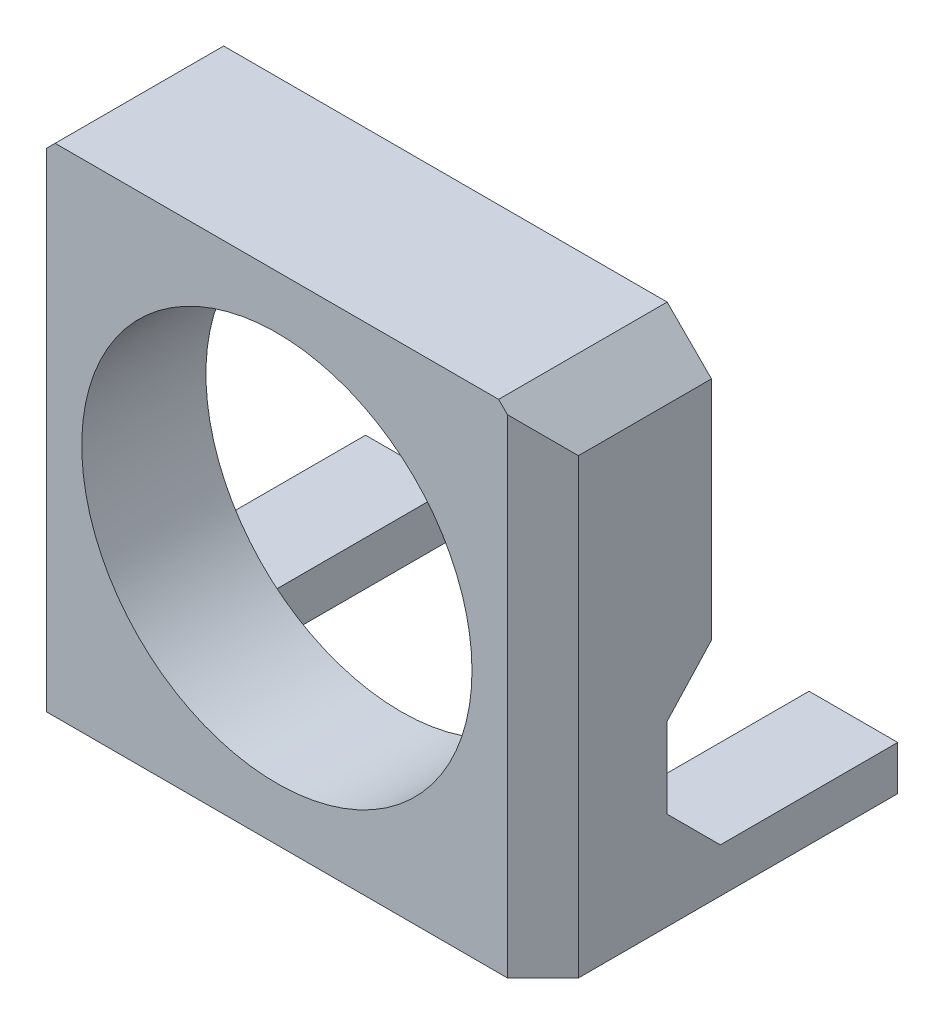
ISO-10303-21;
HEADER;
FILE_DESCRIPTION(('STEP AP214'),'2;1');
FILE_NAME('part.step','',(''),(''),'','','');
FILE_SCHEMA(('AUTOMOTIVE_DESIGN { 1 0 10303 214 1 1 1 1 }'));
ENDSEC;
DATA;
#1=APPLICATION_CONTEXT('core data for automotive mechanical design processes');
#2=APPLICATION_PROTOCOL_DEFINITION('international standard','automotive_design',2000,#1);
#3=PRODUCT_CONTEXT('',#1,'mechanical');
#4=PRODUCT('Part','Part','',(#3));
#5=PRODUCT_RELATED_PRODUCT_CATEGORY('part','',(#4));
#6=PRODUCT_DEFINITION_FORMATION('','',#4);
#7=PRODUCT_DEFINITION_CONTEXT('part definition',#1,'design');
#8=PRODUCT_DEFINITION('design','',#6,#7);
#9=PRODUCT_DEFINITION_SHAPE('','',#8);
#10=(LENGTH_UNIT() NAMED_UNIT(*) SI_UNIT(.MILLI.,.METRE.));
#11=(NAMED_UNIT(*) PLANE_ANGLE_UNIT() SI_UNIT($,.RADIAN.));
#12=(NAMED_UNIT(*) SI_UNIT($,.STERADIAN.) SOLID_ANGLE_UNIT());
#13=UNCERTAINTY_MEASURE_WITH_UNIT(LENGTH_MEASURE(1.E-05),#10,'distance_accuracy_value','');
#14=(GEOMETRIC_REPRESENTATION_CONTEXT(3) GLOBAL_UNCERTAINTY_ASSIGNED_CONTEXT((#13)) GLOBAL_UNIT_ASSIGNED_CONTEXT((#10,
#11,#12)) REPRESENTATION_CONTEXT('',''));
#15=CARTESIAN_POINT('',(0.,0.,0.));
#16=DIRECTION('',(0.,0.,1.));
#17=DIRECTION('',(1.,0.,0.));
#18=AXIS2_PLACEMENT_3D('',#15,#16,#17);
#19=CARTESIAN_POINT('',(0.,0.,0.));
#20=DIRECTION('',(0.,0.,1.));
#21=DIRECTION('',(1.,0.,0.));
#22=AXIS2_PLACEMENT_3D('',#19,#20,#21);
#23=PLANE('',#22);
#24=CARTESIAN_POINT('',(0.,0.,0.));
#25=DIRECTION('',(0.,0.,1.));
#26=DIRECTION('',(1.,0.,0.));
#27=AXIS2_PLACEMENT_3D('',#24,#25,#26);
#28=CIRCLE('',#27,11.);
#29=CARTESIAN_POINT('',(-9.04891222726823,6.25437347007641,0.));
#30=VERTEX_POINT('',#29);
#31=CARTESIAN_POINT('',(10.7829919794879,-2.17418581779493,0.));
#32=VERTEX_POINT('',#31);
#33=EDGE_CURVE('E265',#30,#32,#28,.T.);
#34=ORIENTED_EDGE('',*,*,#33,.T.);
#35=DIRECTION('',(0.920330918458475,-0.391140640344852,0.));
#36=VECTOR('',#35,1.);
#37=CARTESIAN_POINT('',(14.0221483991379,-3.55082729614618,0.));
#38=LINE('',#37,#36);
#39=CARTESIAN_POINT('',(15.,-3.96641422651259,0.));
#40=VERTEX_POINT('',#39);
#41=EDGE_CURVE('E374',#32,#40,#38,.T.);
#42=ORIENTED_EDGE('',*,*,#41,.T.);
#43=DIRECTION('',(0.,1.,0.));
#44=VECTOR('',#43,1.);
#45=CARTESIAN_POINT('',(15.,11.5,0.));
#46=LINE('',#45,#44);
#47=CARTESIAN_POINT('',(15.,-8.50000000000001,0.));
#48=VERTEX_POINT('',#47);
#49=EDGE_CURVE('E287',#48,#40,#46,.T.);
#50=ORIENTED_EDGE('',*,*,#49,.F.);
#51=DIRECTION('',(-1.,0.,0.));
#52=VECTOR('',#51,1.);
#53=CARTESIAN_POINT('',(0.,-8.50000000000001,0.));
#54=LINE('',#53,#52);
#55=CARTESIAN_POINT('',(8.00000000000001,-8.50000000000001,0.));
#56=VERTEX_POINT('',#55);
#57=EDGE_CURVE('E317',#48,#56,#54,.T.);
#58=ORIENTED_EDGE('',*,*,#57,.T.);
#59=DIRECTION('',(0.,-1.,0.));
#60=VECTOR('',#59,1.);
#61=CARTESIAN_POINT('',(8.00000000000001,-14.,0.));
#62=LINE('',#61,#60);
#63=CARTESIAN_POINT('',(8.00000000000001,-14.,0.));
#64=VERTEX_POINT('',#63);
#65=EDGE_CURVE('E333',#56,#64,#62,.T.);
#66=ORIENTED_EDGE('',*,*,#65,.T.);
#67=DIRECTION('',(1.,0.,0.));
#68=VECTOR('',#67,1.);
#69=CARTESIAN_POINT('',(-15.,-14.,0.));
#70=LINE('',#69,#68);
#71=CARTESIAN_POINT('',(-7.99999999999998,-14.,0.));
#72=VERTEX_POINT('',#71);
#73=EDGE_CURVE('E294',#72,#64,#70,.T.);
#74=ORIENTED_EDGE('',*,*,#73,.F.);
#75=DIRECTION('',(0.,1.,0.));
#76=VECTOR('',#75,1.);
#77=CARTESIAN_POINT('',(-7.99999999999998,0.,0.));
#78=LINE('',#77,#76);
#79=CARTESIAN_POINT('',(-7.99999999999998,-8.50000000000001,0.));
#80=VERTEX_POINT('',#79);
#81=EDGE_CURVE('E335',#72,#80,#78,.T.);
#82=ORIENTED_EDGE('',*,*,#81,.T.);
#83=DIRECTION('',(-1.,0.,0.));
#84=VECTOR('',#83,1.);
#85=CARTESIAN_POINT('',(-15.,-8.50000000000001,0.));
#86=LINE('',#85,#84);
#87=CARTESIAN_POINT('',(-15.,-8.50000000000001,0.));
#88=VERTEX_POINT('',#87);
#89=EDGE_CURVE('E319',#80,#88,#86,.T.);
#90=ORIENTED_EDGE('',*,*,#89,.T.);
#91=DIRECTION('',(0.,-1.,0.));
#92=VECTOR('',#91,1.);
#93=CARTESIAN_POINT('',(-15.,11.5,0.));
#94=LINE('',#93,#92);
#95=CARTESIAN_POINT('',(-15.,8.78358577348742,0.));
#96=VERTEX_POINT('',#95);
#97=EDGE_CURVE('E303',#96,#88,#94,.T.);
#98=ORIENTED_EDGE('',*,*,#97,.F.);
#99=DIRECTION('',(0.920330918458475,-0.391140640344852,0.));
#100=VECTOR('',#99,1.);
#101=CARTESIAN_POINT('',(-8.27869643902787,5.92703176007426,0.));
#102=LINE('',#101,#100);
#103=EDGE_CURVE('E216',#96,#30,#102,.T.);
#104=ORIENTED_EDGE('',*,*,#103,.T.);
#105=EDGE_LOOP('',(#34,#42,#50,#58,#66,#74,#82,#90,#98,#104));
#106=FACE_BOUND('',#105,.T.);
#107=ADVANCED_FACE('F43',(#106),#23,.F.);
#108=CARTESIAN_POINT('',(0.,0.,7.));
#109=DIRECTION('',(0.,0.,1.));
#110=DIRECTION('',(1.,0.,0.));
#111=AXIS2_PLACEMENT_3D('',#108,#109,#110);
#112=PLANE('',#111);
#113=DIRECTION('',(-0.707106781186548,-0.707106781186548,0.));
#114=VECTOR('',#113,1.);
#115=CARTESIAN_POINT('',(-15.,11.5,7.));
#116=LINE('',#115,#114);
#117=CARTESIAN_POINT('',(-12.5,14.,7.));
#118=VERTEX_POINT('',#117);
#119=CARTESIAN_POINT('',(-13.,13.5,7.));
#120=VERTEX_POINT('',#119);
#121=EDGE_CURVE('E296',#118,#120,#116,.T.);
#122=ORIENTED_EDGE('',*,*,#121,.T.);
#123=DIRECTION('',(0.,-1.,0.));
#124=VECTOR('',#123,1.);
#125=CARTESIAN_POINT('',(-13.,-14.,7.));
#126=LINE('',#125,#124);
#127=CARTESIAN_POINT('',(-13.,-14.,7.));
#128=VERTEX_POINT('',#127);
#129=EDGE_CURVE('E362',#120,#128,#126,.T.);
#130=ORIENTED_EDGE('',*,*,#129,.T.);
#131=DIRECTION('',(1.,0.,0.));
#132=VECTOR('',#131,1.);
#133=CARTESIAN_POINT('',(-15.,-14.,7.));
#134=LINE('',#133,#132);
#135=CARTESIAN_POINT('',(13.,-14.,7.));
#136=VERTEX_POINT('',#135);
#137=EDGE_CURVE('E299',#128,#136,#134,.T.);
#138=ORIENTED_EDGE('',*,*,#137,.T.);
#139=DIRECTION('',(0.,1.,0.));
#140=VECTOR('',#139,1.);
#141=CARTESIAN_POINT('',(13.,11.5,7.));
#142=LINE('',#141,#140);
#143=CARTESIAN_POINT('',(13.,13.5,7.));
#144=VERTEX_POINT('',#143);
#145=EDGE_CURVE('E352',#136,#144,#142,.T.);
#146=ORIENTED_EDGE('',*,*,#145,.T.);
#147=DIRECTION('',(-0.707106781186548,0.707106781186548,0.));
#148=VECTOR('',#147,1.);
#149=CARTESIAN_POINT('',(12.5,14.,7.));
#150=LINE('',#149,#148);
#151=CARTESIAN_POINT('',(12.5,14.,7.));
#152=VERTEX_POINT('',#151);
#153=EDGE_CURVE('E291',#144,#152,#150,.T.);
#154=ORIENTED_EDGE('',*,*,#153,.T.);
#155=DIRECTION('',(-1.,0.,0.));
#156=VECTOR('',#155,1.);
#157=CARTESIAN_POINT('',(-12.5,14.,7.));
#158=LINE('',#157,#156);
#159=EDGE_CURVE('E293',#152,#118,#158,.T.);
#160=ORIENTED_EDGE('',*,*,#159,.T.);
#161=EDGE_LOOP('',(#122,#130,#138,#146,#154,#160));
#162=FACE_BOUND('',#161,.T.);
#163=CARTESIAN_POINT('',(0.,0.,7.));
#164=DIRECTION('',(0.,0.,1.));
#165=DIRECTION('',(1.,0.,0.));
#166=AXIS2_PLACEMENT_3D('',#163,#164,#165);
#167=CIRCLE('',#166,11.);
#168=CARTESIAN_POINT('',(11.,0.,7.));
#169=VERTEX_POINT('',#168);
#170=EDGE_CURVE('E284',#169,#169,#167,.T.);
#171=ORIENTED_EDGE('',*,*,#170,.F.);
#172=EDGE_LOOP('',(#171));
#173=FACE_BOUND('',#172,.T.);
#174=ADVANCED_FACE('F437',(#162,#173),#112,.T.);
#175=CARTESIAN_POINT('',(15.,11.5,7.));
#176=DIRECTION('',(-1.,0.,0.));
#177=DIRECTION('',(0.,-1.,0.));
#178=AXIS2_PLACEMENT_3D('',#175,#176,#177);
#179=PLANE('',#178);
#180=DIRECTION('',(0.,0.,-1.));
#181=VECTOR('',#180,1.);
#182=CARTESIAN_POINT('',(15.,11.5,7.));
#183=LINE('',#182,#181);
#184=CARTESIAN_POINT('',(15.,11.5,5.));
#185=VERTEX_POINT('',#184);
#186=CARTESIAN_POINT('',(15.,11.5,-2.5));
#187=VERTEX_POINT('',#186);
#188=EDGE_CURVE('E312',#185,#187,#183,.T.);
#189=ORIENTED_EDGE('',*,*,#188,.F.);
#190=DIRECTION('',(0.,-1.,0.));
#191=VECTOR('',#190,1.);
#192=CARTESIAN_POINT('',(15.,-14.,5.));
#193=LINE('',#192,#191);
#194=CARTESIAN_POINT('',(15.,-14.,5.));
#195=VERTEX_POINT('',#194);
#196=EDGE_CURVE('E357',#185,#195,#193,.T.);
#197=ORIENTED_EDGE('',*,*,#196,.T.);
#198=DIRECTION('',(0.,0.,-1.));
#199=VECTOR('',#198,1.);
#200=CARTESIAN_POINT('',(15.,-14.,7.));
#201=LINE('',#200,#199);
#202=CARTESIAN_POINT('',(15.,-14.,-13.));
#203=VERTEX_POINT('',#202);
#204=EDGE_CURVE('E301',#195,#203,#201,.T.);
#205=ORIENTED_EDGE('',*,*,#204,.T.);
#206=DIRECTION('',(0.,1.,0.));
#207=VECTOR('',#206,1.);
#208=CARTESIAN_POINT('',(15.,-14.,-13.));
#209=LINE('',#208,#207);
#210=CARTESIAN_POINT('',(15.,-11.5,-13.));
#211=VERTEX_POINT('',#210);
#212=EDGE_CURVE('E274',#203,#211,#209,.T.);
#213=ORIENTED_EDGE('',*,*,#212,.T.);
#214=DIRECTION('',(0.,0.,1.));
#215=VECTOR('',#214,1.);
#216=CARTESIAN_POINT('',(15.,-11.5,-13.));
#217=LINE('',#216,#215);
#218=CARTESIAN_POINT('',(15.,-11.5,-2.99999999999999));
#219=VERTEX_POINT('',#218);
#220=EDGE_CURVE('E271',#211,#219,#217,.T.);
#221=ORIENTED_EDGE('',*,*,#220,.T.);
#222=DIRECTION('',(0.,0.707106781186547,0.707106781186548));
#223=VECTOR('',#222,1.);
#224=CARTESIAN_POINT('',(15.,4.99999999999999,13.5));
#225=LINE('',#224,#223);
#226=EDGE_CURVE('E331',#219,#48,#225,.T.);
#227=ORIENTED_EDGE('',*,*,#226,.T.);
#228=ORIENTED_EDGE('',*,*,#49,.T.);
#229=DIRECTION('',(0.,-0.73580967544278,0.677188394410884));
#230=VECTOR('',#229,1.);
#231=CARTESIAN_POINT('',(15.,0.91937560986056,-4.49654344750437));
#232=LINE('',#231,#230);
#233=CARTESIAN_POINT('',(15.,-1.25,-2.5));
#234=VERTEX_POINT('',#233);
#235=EDGE_CURVE('E192',#40,#234,#232,.F.);
#236=ORIENTED_EDGE('',*,*,#235,.T.);
#237=DIRECTION('',(0.,-1.,0.));
#238=VECTOR('',#237,1.);
#239=CARTESIAN_POINT('',(15.,11.5,-2.5));
#240=LINE('',#239,#238);
#241=EDGE_CURVE('E227',#187,#234,#240,.T.);
#242=ORIENTED_EDGE('',*,*,#241,.F.);
#243=EDGE_LOOP('',(#189,#197,#205,#213,#221,#227,#228,#236,#242));
#244=FACE_BOUND('',#243,.T.);
#245=ADVANCED_FACE('F390',(#244),#179,.F.);
#246=CARTESIAN_POINT('',(12.5,14.,7.));
#247=DIRECTION('',(-0.707106781186547,-0.707106781186547,0.));
#248=DIRECTION('',(0.707106781186548,-0.707106781186548,0.));
#249=AXIS2_PLACEMENT_3D('',#246,#247,#248);
#250=PLANE('',#249);
#251=ORIENTED_EDGE('',*,*,#153,.F.);
#252=DIRECTION('',(0.577350269189625,-0.577350269189625,-0.577350269189627));
#253=VECTOR('',#252,1.);
#254=CARTESIAN_POINT('',(17.5,9.00000000000001,2.5));
#255=LINE('',#254,#253);
#256=EDGE_CURVE('E355',#144,#185,#255,.T.);
#257=ORIENTED_EDGE('',*,*,#256,.T.);
#258=ORIENTED_EDGE('',*,*,#188,.T.);
#259=DIRECTION('',(0.707106781186548,-0.707106781186548,0.));
#260=VECTOR('',#259,1.);
#261=CARTESIAN_POINT('',(12.5,14.,-2.5));
#262=LINE('',#261,#260);
#263=CARTESIAN_POINT('',(12.5,14.,-2.5));
#264=VERTEX_POINT('',#263);
#265=EDGE_CURVE('E235',#264,#187,#262,.T.);
#266=ORIENTED_EDGE('',*,*,#265,.F.);
#267=DIRECTION('',(0.,0.,-1.));
#268=VECTOR('',#267,1.);
#269=CARTESIAN_POINT('',(12.5,14.,7.));
#270=LINE('',#269,#268);
#271=EDGE_CURVE('E310',#152,#264,#270,.T.);
#272=ORIENTED_EDGE('',*,*,#271,.F.);
#273=EDGE_LOOP('',(#251,#257,#258,#266,#272));
#274=FACE_BOUND('',#273,.T.);
#275=ADVANCED_FACE('F456',(#274),#250,.F.);
#276=CARTESIAN_POINT('',(-12.5,14.,7.));
#277=DIRECTION('',(0.,-1.,0.));
#278=DIRECTION('',(0.,0.,-1.));
#279=AXIS2_PLACEMENT_3D('',#276,#277,#278);
#280=PLANE('',#279);
#281=ORIENTED_EDGE('',*,*,#271,.T.);
#282=DIRECTION('',(1.,0.,0.));
#283=VECTOR('',#282,1.);
#284=CARTESIAN_POINT('',(-12.5,14.,-2.5));
#285=LINE('',#284,#283);
#286=CARTESIAN_POINT('',(-12.5,14.,-2.5));
#287=VERTEX_POINT('',#286);
#288=EDGE_CURVE('E233',#287,#264,#285,.T.);
#289=ORIENTED_EDGE('',*,*,#288,.F.);
#290=DIRECTION('',(0.,0.,-1.));
#291=VECTOR('',#290,1.);
#292=CARTESIAN_POINT('',(-12.5,14.,7.));
#293=LINE('',#292,#291);
#294=EDGE_CURVE('E207',#118,#287,#293,.T.);
#295=ORIENTED_EDGE('',*,*,#294,.F.);
#296=ORIENTED_EDGE('',*,*,#159,.F.);
#297=EDGE_LOOP('',(#281,#289,#295,#296));
#298=FACE_BOUND('',#297,.T.);
#299=ADVANCED_FACE('F453',(#298),#280,.F.);
#300=CARTESIAN_POINT('',(-15.,11.5,7.));
#301=DIRECTION('',(0.707106781186547,-0.707106781186547,0.));
#302=DIRECTION('',(0.707106781186548,0.707106781186548,0.));
#303=AXIS2_PLACEMENT_3D('',#300,#301,#302);
#304=PLANE('',#303);
#305=DIRECTION('',(0.,0.,-1.));
#306=VECTOR('',#305,1.);
#307=CARTESIAN_POINT('',(-15.,11.5,7.));
#308=LINE('',#307,#306);
#309=CARTESIAN_POINT('',(-15.,11.5,4.99999999999998));
#310=VERTEX_POINT('',#309);
#311=CARTESIAN_POINT('',(-15.,11.5,-2.49999999999999));
#312=VERTEX_POINT('',#311);
#313=EDGE_CURVE('E197',#310,#312,#308,.T.);
#314=ORIENTED_EDGE('',*,*,#313,.F.);
#315=DIRECTION('',(0.577350269189625,0.577350269189625,0.577350269189627));
#316=VECTOR('',#315,1.);
#317=CARTESIAN_POINT('',(-17.5,9.00000000000002,2.49999999999999));
#318=LINE('',#317,#316);
#319=EDGE_CURVE('E368',#310,#120,#318,.T.);
#320=ORIENTED_EDGE('',*,*,#319,.T.);
#321=ORIENTED_EDGE('',*,*,#121,.F.);
#322=ORIENTED_EDGE('',*,*,#294,.T.);
#323=DIRECTION('',(0.707106781186548,0.707106781186548,0.));
#324=VECTOR('',#323,1.);
#325=CARTESIAN_POINT('',(-15.,11.5,-2.5));
#326=LINE('',#325,#324);
#327=EDGE_CURVE('E222',#312,#287,#326,.T.);
#328=ORIENTED_EDGE('',*,*,#327,.F.);
#329=EDGE_LOOP('',(#314,#320,#321,#322,#328));
#330=FACE_BOUND('',#329,.T.);
#331=ADVANCED_FACE('F230',(#330),#304,.F.);
#332=CARTESIAN_POINT('',(-15.,11.5,7.));
#333=DIRECTION('',(1.,0.,0.));
#334=DIRECTION('',(0.,1.,0.));
#335=AXIS2_PLACEMENT_3D('',#332,#333,#334);
#336=PLANE('',#335);
#337=DIRECTION('',(0.,0.,-1.));
#338=VECTOR('',#337,1.);
#339=CARTESIAN_POINT('',(-15.,-14.,7.));
#340=LINE('',#339,#338);
#341=CARTESIAN_POINT('',(-15.,-14.,4.99999999999998));
#342=VERTEX_POINT('',#341);
#343=CARTESIAN_POINT('',(-15.,-14.,-13.));
#344=VERTEX_POINT('',#343);
#345=EDGE_CURVE('E208',#342,#344,#340,.T.);
#346=ORIENTED_EDGE('',*,*,#345,.F.);
#347=DIRECTION('',(0.,1.,0.));
#348=VECTOR('',#347,1.);
#349=CARTESIAN_POINT('',(-15.,11.5,4.99999999999998));
#350=LINE('',#349,#348);
#351=EDGE_CURVE('E203',#342,#310,#350,.T.);
#352=ORIENTED_EDGE('',*,*,#351,.T.);
#353=ORIENTED_EDGE('',*,*,#313,.T.);
#354=DIRECTION('',(0.,0.73580967544278,-0.677188394410884));
#355=VECTOR('',#354,1.);
#356=CARTESIAN_POINT('',(-15.,6.76632315930166,1.85654915448553));
#357=LINE('',#356,#355);
#358=EDGE_CURVE('E53',#312,#96,#357,.F.);
#359=ORIENTED_EDGE('',*,*,#358,.T.);
#360=ORIENTED_EDGE('',*,*,#97,.T.);
#361=DIRECTION('',(0.,0.707106781186547,0.707106781186548));
#362=VECTOR('',#361,1.);
#363=CARTESIAN_POINT('',(-15.,4.99999999999999,13.5));
#364=LINE('',#363,#362);
#365=CARTESIAN_POINT('',(-15.,-11.5,-2.99999999999999));
#366=VERTEX_POINT('',#365);
#367=EDGE_CURVE('E327',#88,#366,#364,.F.);
#368=ORIENTED_EDGE('',*,*,#367,.T.);
#369=DIRECTION('',(0.,0.,1.));
#370=VECTOR('',#369,1.);
#371=CARTESIAN_POINT('',(-15.,-11.5,-13.));
#372=LINE('',#371,#370);
#373=CARTESIAN_POINT('',(-15.,-11.5,-13.));
#374=VERTEX_POINT('',#373);
#375=EDGE_CURVE('E262',#374,#366,#372,.T.);
#376=ORIENTED_EDGE('',*,*,#375,.F.);
#377=DIRECTION('',(0.,1.,0.));
#378=VECTOR('',#377,1.);
#379=CARTESIAN_POINT('',(-15.,-14.,-13.));
#380=LINE('',#379,#378);
#381=EDGE_CURVE('E244',#344,#374,#380,.T.);
#382=ORIENTED_EDGE('',*,*,#381,.F.);
#383=EDGE_LOOP('',(#346,#352,#353,#359,#360,#368,#376,#382));
#384=FACE_BOUND('',#383,.T.);
#385=ADVANCED_FACE('F200',(#384),#336,.F.);
#386=CARTESIAN_POINT('',(-15.,-14.,7.));
#387=DIRECTION('',(0.,1.,0.));
#388=DIRECTION('',(0.,0.,1.));
#389=AXIS2_PLACEMENT_3D('',#386,#387,#388);
#390=PLANE('',#389);
#391=ORIENTED_EDGE('',*,*,#137,.F.);
#392=DIRECTION('',(-0.707106781186546,0.,-0.707106781186549));
#393=VECTOR('',#392,1.);
#394=CARTESIAN_POINT('',(-13.,-14.,7.));
#395=LINE('',#394,#393);
#396=EDGE_CURVE('E365',#128,#342,#395,.T.);
#397=ORIENTED_EDGE('',*,*,#396,.T.);
#398=ORIENTED_EDGE('',*,*,#345,.T.);
#399=DIRECTION('',(1.,0.,0.));
#400=VECTOR('',#399,1.);
#401=CARTESIAN_POINT('',(-15.,-14.,-13.));
#402=LINE('',#401,#400);
#403=CARTESIAN_POINT('',(-10.,-14.,-13.));
#404=VERTEX_POINT('',#403);
#405=EDGE_CURVE('E253',#344,#404,#402,.T.);
#406=ORIENTED_EDGE('',*,*,#405,.T.);
#407=DIRECTION('',(0.,0.,1.));
#408=VECTOR('',#407,1.);
#409=CARTESIAN_POINT('',(-10.,-14.,-13.));
#410=LINE('',#409,#408);
#411=CARTESIAN_POINT('',(-10.,-14.,-2.00000000000001));
#412=VERTEX_POINT('',#411);
#413=EDGE_CURVE('E256',#404,#412,#410,.T.);
#414=ORIENTED_EDGE('',*,*,#413,.T.);
#415=DIRECTION('',(0.70710678118655,0.,0.707106781186545));
#416=VECTOR('',#415,1.);
#417=CARTESIAN_POINT('',(-8.00000000000002,-14.,0.));
#418=LINE('',#417,#416);
#419=EDGE_CURVE('E345',#412,#72,#418,.T.);
#420=ORIENTED_EDGE('',*,*,#419,.T.);
#421=ORIENTED_EDGE('',*,*,#73,.T.);
#422=DIRECTION('',(-0.707106781186544,0.,0.707106781186551));
#423=VECTOR('',#422,1.);
#424=CARTESIAN_POINT('',(-6.99999999999987,-14.,15.));
#425=LINE('',#424,#423);
#426=CARTESIAN_POINT('',(10.,-14.,-2.00000000000001));
#427=VERTEX_POINT('',#426);
#428=EDGE_CURVE('E350',#64,#427,#425,.F.);
#429=ORIENTED_EDGE('',*,*,#428,.T.);
#430=DIRECTION('',(0.,0.,1.));
#431=VECTOR('',#430,1.);
#432=CARTESIAN_POINT('',(10.,-14.,-13.));
#433=LINE('',#432,#431);
#434=CARTESIAN_POINT('',(10.,-14.,-13.));
#435=VERTEX_POINT('',#434);
#436=EDGE_CURVE('E241',#435,#427,#433,.T.);
#437=ORIENTED_EDGE('',*,*,#436,.F.);
#438=DIRECTION('',(-1.,0.,0.));
#439=VECTOR('',#438,1.);
#440=CARTESIAN_POINT('',(15.,-14.,-13.));
#441=LINE('',#440,#439);
#442=EDGE_CURVE('E248',#203,#435,#441,.T.);
#443=ORIENTED_EDGE('',*,*,#442,.F.);
#444=ORIENTED_EDGE('',*,*,#204,.F.);
#445=DIRECTION('',(-0.707106781186546,0.,0.707106781186549));
#446=VECTOR('',#445,1.);
#447=CARTESIAN_POINT('',(13.,-14.,7.));
#448=LINE('',#447,#446);
#449=EDGE_CURVE('E359',#195,#136,#448,.T.);
#450=ORIENTED_EDGE('',*,*,#449,.T.);
#451=EDGE_LOOP('',(#391,#397,#398,#406,#414,#420,#421,#429,#437,#443,#444,#450));
#452=FACE_BOUND('',#451,.T.);
#453=ADVANCED_FACE('F400',(#452),#390,.F.);
#454=CARTESIAN_POINT('',(0.,0.,7.));
#455=DIRECTION('',(0.,0.,-1.));
#456=DIRECTION('',(-1.,0.,0.));
#457=AXIS2_PLACEMENT_3D('',#454,#455,#456);
#458=CYLINDRICAL_SURFACE('',#457,11.);
#459=ORIENTED_EDGE('',*,*,#170,.T.);
#460=EDGE_LOOP('',(#459));
#461=FACE_BOUND('',#460,.T.);
#462=CARTESIAN_POINT('',(10.9906277921096,0.453983188353408,0.));
#463=VERTEX_POINT('',#462);
#464=CARTESIAN_POINT('',(-7.30084483816574,8.22785905622044,0.));
#465=VERTEX_POINT('',#464);
#466=EDGE_CURVE('E288',#463,#465,#28,.T.);
#467=ORIENTED_EDGE('',*,*,#466,.F.);
#468=DIRECTION('',(0.,0.,-1.));
#469=VECTOR('',#468,1.);
#470=CARTESIAN_POINT('',(10.9906277921096,0.453983188353409,-2.5));
#471=LINE('',#470,#469);
#472=CARTESIAN_POINT('',(10.9906277921096,0.453983188353409,-2.5));
#473=VERTEX_POINT('',#472);
#474=EDGE_CURVE('E371',#473,#463,#471,.F.);
#475=ORIENTED_EDGE('',*,*,#474,.F.);
#476=CARTESIAN_POINT('',(0.,0.,2.21669595709968));
#477=DIRECTION('',(-0.276578199185493,-0.65077223337763,-0.707106781186548));
#478=DIRECTION('',(0.276578199185493,0.650772233377631,-0.707106781186547));
#479=AXIS2_PLACEMENT_3D('',#476,#477,#478);
#480=ELLIPSE('',#479,15.556349186104,11.);
#481=EDGE_CURVE('E376',#473,#32,#480,.T.);
#482=ORIENTED_EDGE('',*,*,#481,.T.);
#483=ORIENTED_EDGE('',*,*,#33,.F.);
#484=CARTESIAN_POINT('',(0.,0.,2.21669595709969));
#485=DIRECTION('',(-0.276578199185493,-0.65077223337763,-0.707106781186548));
#486=DIRECTION('',(0.276578199185493,0.650772233377631,-0.707106781186547));
#487=AXIS2_PLACEMENT_3D('',#484,#485,#486);
#488=ELLIPSE('',#487,15.556349186104,11.);
#489=CARTESIAN_POINT('',(-7.30084483816573,8.22785905622044,-2.5));
#490=VERTEX_POINT('',#489);
#491=EDGE_CURVE('E11',#30,#490,#488,.T.);
#492=ORIENTED_EDGE('',*,*,#491,.T.);
#493=DIRECTION('',(0.,0.,-1.));
#494=VECTOR('',#493,1.);
#495=CARTESIAN_POINT('',(-7.30084483816574,8.22785905622044,0.));
#496=LINE('',#495,#494);
#497=EDGE_CURVE('E59',#465,#490,#496,.T.);
#498=ORIENTED_EDGE('',*,*,#497,.F.);
#499=EDGE_LOOP('',(#467,#475,#482,#483,#492,#498));
#500=FACE_BOUND('',#499,.T.);
#501=ADVANCED_FACE('F381',(#461,#500),#458,.F.);
#502=CARTESIAN_POINT('',(10.,-14.,-13.));
#503=DIRECTION('',(1.,0.,0.));
#504=DIRECTION('',(0.,0.,-1.));
#505=AXIS2_PLACEMENT_3D('',#502,#503,#504);
#506=PLANE('',#505);
#507=ORIENTED_EDGE('',*,*,#436,.T.);
#508=DIRECTION('',(0.,1.,0.));
#509=VECTOR('',#508,1.);
#510=CARTESIAN_POINT('',(10.,-8.50000000000001,-2.00000000000001));
#511=LINE('',#510,#509);
#512=CARTESIAN_POINT('',(10.,-10.5,-2.00000000000001));
#513=VERTEX_POINT('',#512);
#514=EDGE_CURVE('E340',#427,#513,#511,.T.);
#515=ORIENTED_EDGE('',*,*,#514,.T.);
#516=DIRECTION('',(0.,-0.707106781186547,-0.707106781186548));
#517=VECTOR('',#516,1.);
#518=CARTESIAN_POINT('',(10.,-17.75,-9.25));
#519=LINE('',#518,#517);
#520=CARTESIAN_POINT('',(10.,-11.5,-2.99999999999999));
#521=VERTEX_POINT('',#520);
#522=EDGE_CURVE('E329',#513,#521,#519,.T.);
#523=ORIENTED_EDGE('',*,*,#522,.T.);
#524=DIRECTION('',(0.,0.,1.));
#525=VECTOR('',#524,1.);
#526=CARTESIAN_POINT('',(10.,-11.5,-13.));
#527=LINE('',#526,#525);
#528=CARTESIAN_POINT('',(10.,-11.5,-13.));
#529=VERTEX_POINT('',#528);
#530=EDGE_CURVE('E268',#529,#521,#527,.T.);
#531=ORIENTED_EDGE('',*,*,#530,.F.);
#532=DIRECTION('',(0.,1.,0.));
#533=VECTOR('',#532,1.);
#534=CARTESIAN_POINT('',(10.,-14.,-13.));
#535=LINE('',#534,#533);
#536=EDGE_CURVE('E280',#435,#529,#535,.T.);
#537=ORIENTED_EDGE('',*,*,#536,.F.);
#538=EDGE_LOOP('',(#507,#515,#523,#531,#537));
#539=FACE_BOUND('',#538,.T.);
#540=ADVANCED_FACE('F423',(#539),#506,.F.);
#541=CARTESIAN_POINT('',(15.,-11.5,-13.));
#542=DIRECTION('',(0.,1.,0.));
#543=DIRECTION('',(0.,0.,1.));
#544=AXIS2_PLACEMENT_3D('',#541,#542,#543);
#545=PLANE('',#544);
#546=ORIENTED_EDGE('',*,*,#530,.T.);
#547=DIRECTION('',(1.,0.,0.));
#548=VECTOR('',#547,1.);
#549=CARTESIAN_POINT('',(15.,-11.5,-2.99999999999999));
#550=LINE('',#549,#548);
#551=EDGE_CURVE('E322',#521,#219,#550,.T.);
#552=ORIENTED_EDGE('',*,*,#551,.T.);
#553=ORIENTED_EDGE('',*,*,#220,.F.);
#554=DIRECTION('',(-1.,0.,0.));
#555=VECTOR('',#554,1.);
#556=CARTESIAN_POINT('',(15.,-11.5,-13.));
#557=LINE('',#556,#555);
#558=EDGE_CURVE('E277',#211,#529,#557,.T.);
#559=ORIENTED_EDGE('',*,*,#558,.T.);
#560=EDGE_LOOP('',(#546,#552,#553,#559));
#561=FACE_BOUND('',#560,.T.);
#562=ADVANCED_FACE('F410',(#561),#545,.T.);
#563=CARTESIAN_POINT('',(0.,0.,-13.));
#564=DIRECTION('',(0.,0.,-1.));
#565=DIRECTION('',(-1.,0.,0.));
#566=AXIS2_PLACEMENT_3D('',#563,#564,#565);
#567=PLANE('',#566);
#568=ORIENTED_EDGE('',*,*,#442,.T.);
#569=ORIENTED_EDGE('',*,*,#536,.T.);
#570=ORIENTED_EDGE('',*,*,#558,.F.);
#571=ORIENTED_EDGE('',*,*,#212,.F.);
#572=EDGE_LOOP('',(#568,#569,#570,#571));
#573=FACE_BOUND('',#572,.T.);
#574=ADVANCED_FACE('F407',(#573),#567,.T.);
#575=CARTESIAN_POINT('',(-15.,-11.5,-13.));
#576=DIRECTION('',(0.,-1.,0.));
#577=DIRECTION('',(0.,0.,-1.));
#578=AXIS2_PLACEMENT_3D('',#575,#576,#577);
#579=PLANE('',#578);
#580=ORIENTED_EDGE('',*,*,#375,.T.);
#581=DIRECTION('',(1.,0.,0.));
#582=VECTOR('',#581,1.);
#583=CARTESIAN_POINT('',(-10.,-11.5,-2.99999999999999));
#584=LINE('',#583,#582);
#585=CARTESIAN_POINT('',(-10.,-11.5,-2.99999999999999));
#586=VERTEX_POINT('',#585);
#587=EDGE_CURVE('E314',#366,#586,#584,.T.);
#588=ORIENTED_EDGE('',*,*,#587,.T.);
#589=DIRECTION('',(0.,0.,1.));
#590=VECTOR('',#589,1.);
#591=CARTESIAN_POINT('',(-10.,-11.5,-13.));
#592=LINE('',#591,#590);
#593=CARTESIAN_POINT('',(-10.,-11.5,-13.));
#594=VERTEX_POINT('',#593);
#595=EDGE_CURVE('E259',#594,#586,#592,.T.);
#596=ORIENTED_EDGE('',*,*,#595,.F.);
#597=DIRECTION('',(1.,0.,0.));
#598=VECTOR('',#597,1.);
#599=CARTESIAN_POINT('',(-15.,-11.5,-13.));
#600=LINE('',#599,#598);
#601=EDGE_CURVE('E247',#374,#594,#600,.T.);
#602=ORIENTED_EDGE('',*,*,#601,.F.);
#603=EDGE_LOOP('',(#580,#588,#596,#602));
#604=FACE_BOUND('',#603,.T.);
#605=ADVANCED_FACE('F520',(#604),#579,.F.);
#606=CARTESIAN_POINT('',(-10.,-14.,-13.));
#607=DIRECTION('',(1.,0.,0.));
#608=DIRECTION('',(0.,0.,-1.));
#609=AXIS2_PLACEMENT_3D('',#606,#607,#608);
#610=PLANE('',#609);
#611=DIRECTION('',(0.,-0.707106781186547,-0.707106781186548));
#612=VECTOR('',#611,1.);
#613=CARTESIAN_POINT('',(-10.,-11.5,-2.99999999999999));
#614=LINE('',#613,#612);
#615=CARTESIAN_POINT('',(-10.,-10.5,-2.));
#616=VERTEX_POINT('',#615);
#617=EDGE_CURVE('E324',#586,#616,#614,.F.);
#618=ORIENTED_EDGE('',*,*,#617,.T.);
#619=DIRECTION('',(0.,-1.,0.));
#620=VECTOR('',#619,1.);
#621=CARTESIAN_POINT('',(-10.,-14.,-2.));
#622=LINE('',#621,#620);
#623=EDGE_CURVE('E338',#616,#412,#622,.T.);
#624=ORIENTED_EDGE('',*,*,#623,.T.);
#625=ORIENTED_EDGE('',*,*,#413,.F.);
#626=DIRECTION('',(0.,1.,0.));
#627=VECTOR('',#626,1.);
#628=CARTESIAN_POINT('',(-10.,-14.,-13.));
#629=LINE('',#628,#627);
#630=EDGE_CURVE('E250',#404,#594,#629,.T.);
#631=ORIENTED_EDGE('',*,*,#630,.T.);
#632=ORIENTED_EDGE('',*,*,#595,.T.);
#633=EDGE_LOOP('',(#618,#624,#625,#631,#632));
#634=FACE_BOUND('',#633,.T.);
#635=ADVANCED_FACE('F518',(#634),#610,.T.);
#636=CARTESIAN_POINT('',(0.,0.,-13.));
#637=DIRECTION('',(0.,0.,-1.));
#638=DIRECTION('',(-1.,0.,0.));
#639=AXIS2_PLACEMENT_3D('',#636,#637,#638);
#640=PLANE('',#639);
#641=ORIENTED_EDGE('',*,*,#381,.T.);
#642=ORIENTED_EDGE('',*,*,#601,.T.);
#643=ORIENTED_EDGE('',*,*,#630,.F.);
#644=ORIENTED_EDGE('',*,*,#405,.F.);
#645=EDGE_LOOP('',(#641,#642,#643,#644));
#646=FACE_BOUND('',#645,.T.);
#647=ADVANCED_FACE('F468',(#646),#640,.T.);
#648=CARTESIAN_POINT('',(-15.,-11.5,-2.99999999999999));
#649=DIRECTION('',(0.,0.707106781186548,-0.707106781186547));
#650=DIRECTION('',(-1.,0.,0.));
#651=AXIS2_PLACEMENT_3D('',#648,#649,#650);
#652=PLANE('',#651);
#653=ORIENTED_EDGE('',*,*,#367,.F.);
#654=ORIENTED_EDGE('',*,*,#89,.F.);
#655=DIRECTION('',(0.577350269189629,0.577350269189624,0.577350269189625));
#656=VECTOR('',#655,1.);
#657=CARTESIAN_POINT('',(-12.3333333333333,-12.8333333333333,-4.33333333333333));
#658=LINE('',#657,#656);
#659=EDGE_CURVE('E343',#80,#616,#658,.F.);
#660=ORIENTED_EDGE('',*,*,#659,.T.);
#661=ORIENTED_EDGE('',*,*,#617,.F.);
#662=ORIENTED_EDGE('',*,*,#587,.F.);
#663=EDGE_LOOP('',(#653,#654,#660,#661,#662));
#664=FACE_BOUND('',#663,.T.);
#665=ADVANCED_FACE('F462',(#664),#652,.T.);
#666=CARTESIAN_POINT('',(0.,-8.50000000000001,0.));
#667=DIRECTION('',(0.,-0.707106781186548,0.707106781186547));
#668=DIRECTION('',(-1.,0.,0.));
#669=AXIS2_PLACEMENT_3D('',#666,#667,#668);
#670=PLANE('',#669);
#671=ORIENTED_EDGE('',*,*,#226,.F.);
#672=ORIENTED_EDGE('',*,*,#551,.F.);
#673=ORIENTED_EDGE('',*,*,#522,.F.);
#674=DIRECTION('',(0.577350269189622,-0.577350269189628,-0.577350269189628));
#675=VECTOR('',#674,1.);
#676=CARTESIAN_POINT('',(5.33333333333338,-5.83333333333335,2.66666666666666));
#677=LINE('',#676,#675);
#678=EDGE_CURVE('E347',#513,#56,#677,.F.);
#679=ORIENTED_EDGE('',*,*,#678,.T.);
#680=ORIENTED_EDGE('',*,*,#57,.F.);
#681=EDGE_LOOP('',(#671,#672,#673,#679,#680));
#682=FACE_BOUND('',#681,.T.);
#683=ADVANCED_FACE('F414',(#682),#670,.F.);
#684=CARTESIAN_POINT('',(-7.99999999999998,0.,0.));
#685=DIRECTION('',(-0.707106781186545,0.,0.70710678118655));
#686=DIRECTION('',(0.,1.,0.));
#687=AXIS2_PLACEMENT_3D('',#684,#685,#686);
#688=PLANE('',#687);
#689=ORIENTED_EDGE('',*,*,#419,.F.);
#690=ORIENTED_EDGE('',*,*,#623,.F.);
#691=ORIENTED_EDGE('',*,*,#659,.F.);
#692=ORIENTED_EDGE('',*,*,#81,.F.);
#693=EDGE_LOOP('',(#689,#690,#691,#692));
#694=FACE_BOUND('',#693,.T.);
#695=ADVANCED_FACE('F475',(#694),#688,.F.);
#696=CARTESIAN_POINT('',(10.,-14.,-2.00000000000001));
#697=DIRECTION('',(-0.707106781186551,0.,-0.707106781186544));
#698=DIRECTION('',(0.,-1.,0.));
#699=AXIS2_PLACEMENT_3D('',#696,#697,#698);
#700=PLANE('',#699);
#701=ORIENTED_EDGE('',*,*,#428,.F.);
#702=ORIENTED_EDGE('',*,*,#65,.F.);
#703=ORIENTED_EDGE('',*,*,#678,.F.);
#704=ORIENTED_EDGE('',*,*,#514,.F.);
#705=EDGE_LOOP('',(#701,#702,#703,#704));
#706=FACE_BOUND('',#705,.T.);
#707=ADVANCED_FACE('F421',(#706),#700,.T.);
#708=CARTESIAN_POINT('',(13.,0.,7.));
#709=DIRECTION('',(0.707106781186549,0.,0.707106781186546));
#710=DIRECTION('',(0.,-1.,0.));
#711=AXIS2_PLACEMENT_3D('',#708,#709,#710);
#712=PLANE('',#711);
#713=ORIENTED_EDGE('',*,*,#449,.F.);
#714=ORIENTED_EDGE('',*,*,#196,.F.);
#715=ORIENTED_EDGE('',*,*,#256,.F.);
#716=ORIENTED_EDGE('',*,*,#145,.F.);
#717=EDGE_LOOP('',(#713,#714,#715,#716));
#718=FACE_BOUND('',#717,.T.);
#719=ADVANCED_FACE('F396',(#718),#712,.T.);
#720=CARTESIAN_POINT('',(-13.,0.,7.));
#721=DIRECTION('',(-0.707106781186549,0.,0.707106781186546));
#722=DIRECTION('',(0.,1.,0.));
#723=AXIS2_PLACEMENT_3D('',#720,#721,#722);
#724=PLANE('',#723);
#725=ORIENTED_EDGE('',*,*,#319,.F.);
#726=ORIENTED_EDGE('',*,*,#351,.F.);
#727=ORIENTED_EDGE('',*,*,#396,.F.);
#728=ORIENTED_EDGE('',*,*,#129,.F.);
#729=EDGE_LOOP('',(#725,#726,#727,#728));
#730=FACE_BOUND('',#729,.T.);
#731=ADVANCED_FACE('F492',(#730),#724,.T.);
#732=CARTESIAN_POINT('',(0.,0.,0.));
#733=DIRECTION('',(0.,0.,1.));
#734=DIRECTION('',(1.,0.,0.));
#735=AXIS2_PLACEMENT_3D('',#732,#733,#734);
#736=PLANE('',#735);
#737=DIRECTION('',(-0.920330918458474,0.391140640344852,0.));
#738=VECTOR('',#737,1.);
#739=CARTESIAN_POINT('',(15.,-1.25,0.));
#740=LINE('',#739,#738);
#741=EDGE_CURVE('E242',#463,#465,#740,.T.);
#742=ORIENTED_EDGE('',*,*,#741,.F.);
#743=ORIENTED_EDGE('',*,*,#466,.T.);
#744=EDGE_LOOP('',(#742,#743));
#745=FACE_BOUND('',#744,.T.);
#746=ADVANCED_FACE('F497',(#745),#736,.T.);
#747=CARTESIAN_POINT('',(15.,-1.25,-2.5));
#748=DIRECTION('',(0.391140640344852,0.920330918458474,0.));
#749=DIRECTION('',(-0.920330918458475,0.391140640344852,0.));
#750=AXIS2_PLACEMENT_3D('',#747,#748,#749);
#751=PLANE('',#750);
#752=DIRECTION('',(-0.920330918458474,0.391140640344852,0.));
#753=VECTOR('',#752,1.);
#754=CARTESIAN_POINT('',(15.,-1.25,-2.5));
#755=LINE('',#754,#753);
#756=EDGE_CURVE('E226',#473,#490,#755,.T.);
#757=ORIENTED_EDGE('',*,*,#756,.F.);
#758=ORIENTED_EDGE('',*,*,#474,.T.);
#759=ORIENTED_EDGE('',*,*,#741,.T.);
#760=ORIENTED_EDGE('',*,*,#497,.T.);
#761=EDGE_LOOP('',(#757,#758,#759,#760));
#762=FACE_BOUND('',#761,.T.);
#763=ADVANCED_FACE('F506',(#762),#751,.F.);
#764=CARTESIAN_POINT('',(0.,0.,-2.5));
#765=DIRECTION('',(0.,0.,1.));
#766=DIRECTION('',(1.,0.,0.));
#767=AXIS2_PLACEMENT_3D('',#764,#765,#766);
#768=PLANE('',#767);
#769=ORIENTED_EDGE('',*,*,#241,.T.);
#770=EDGE_CURVE('E229',#234,#473,#755,.T.);
#771=ORIENTED_EDGE('',*,*,#770,.T.);
#772=ORIENTED_EDGE('',*,*,#756,.T.);
#773=EDGE_CURVE('E215',#490,#312,#755,.T.);
#774=ORIENTED_EDGE('',*,*,#773,.T.);
#775=ORIENTED_EDGE('',*,*,#327,.T.);
#776=ORIENTED_EDGE('',*,*,#288,.T.);
#777=ORIENTED_EDGE('',*,*,#265,.T.);
#778=EDGE_LOOP('',(#769,#771,#772,#774,#775,#776,#777));
#779=FACE_BOUND('',#778,.T.);
#780=ADVANCED_FACE('F220',(#779),#768,.F.);
#781=CARTESIAN_POINT('',(15.,-1.25,-2.5));
#782=DIRECTION('',(-0.276578199185493,-0.65077223337763,-0.707106781186548));
#783=DIRECTION('',(0.920330918458475,-0.391140640344852,0.));
#784=AXIS2_PLACEMENT_3D('',#781,#782,#783);
#785=PLANE('',#784);
#786=ORIENTED_EDGE('',*,*,#235,.F.);
#787=ORIENTED_EDGE('',*,*,#41,.F.);
#788=ORIENTED_EDGE('',*,*,#481,.F.);
#789=ORIENTED_EDGE('',*,*,#770,.F.);
#790=EDGE_LOOP('',(#786,#787,#788,#789));
#791=FACE_BOUND('',#790,.T.);
#792=ADVANCED_FACE('F387',(#791),#785,.T.);
#793=CARTESIAN_POINT('',(15.,-1.25,-2.49999999999999));
#794=DIRECTION('',(-0.276578199185493,-0.65077223337763,-0.707106781186548));
#795=DIRECTION('',(0.920330918458475,-0.391140640344852,0.));
#796=AXIS2_PLACEMENT_3D('',#793,#794,#795);
#797=PLANE('',#796);
#798=ORIENTED_EDGE('',*,*,#491,.F.);
#799=ORIENTED_EDGE('',*,*,#103,.F.);
#800=ORIENTED_EDGE('',*,*,#358,.F.);
#801=ORIENTED_EDGE('',*,*,#773,.F.);
#802=EDGE_LOOP('',(#798,#799,#800,#801));
#803=FACE_BOUND('',#802,.T.);
#804=ADVANCED_FACE('F46',(#803),#797,.T.);
#805=CLOSED_SHELL('',(#107,#174,#245,#275,#299,#331,#385,#453,#501,#540,#562,#574,#605,#635,
#647,#665,#683,#695,#707,#719,#731,#746,#763,#780,#792,#804));
#806=MANIFOLD_SOLID_BREP('B2',#805);
#807=ADVANCED_BREP_SHAPE_REPRESENTATION('',(#18,#806),#14);
#808=SHAPE_DEFINITION_REPRESENTATION(#9,#807);
ENDSEC;
END-ISO-10303-21;
